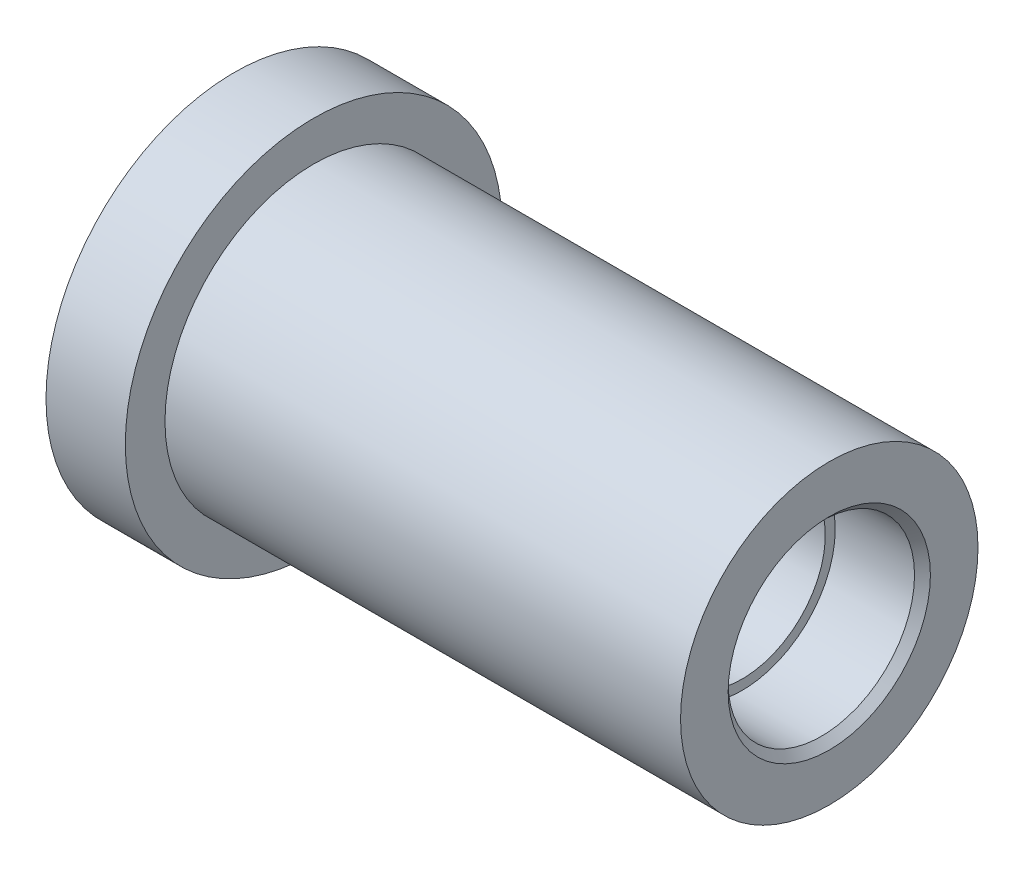
ISO-10303-21;
HEADER;
FILE_DESCRIPTION(('STEP AP214'),'2;1');
FILE_NAME('part.step','',(''),(''),'','','');
FILE_SCHEMA(('AUTOMOTIVE_DESIGN { 1 0 10303 214 1 1 1 1 }'));
ENDSEC;
DATA;
#1=APPLICATION_CONTEXT('core data for automotive mechanical design processes');
#2=APPLICATION_PROTOCOL_DEFINITION('international standard','automotive_design',2000,#1);
#3=PRODUCT_CONTEXT('',#1,'mechanical');
#4=PRODUCT('Part','Part','',(#3));
#5=PRODUCT_RELATED_PRODUCT_CATEGORY('part','',(#4));
#6=PRODUCT_DEFINITION_FORMATION('','',#4);
#7=PRODUCT_DEFINITION_CONTEXT('part definition',#1,'design');
#8=PRODUCT_DEFINITION('design','',#6,#7);
#9=PRODUCT_DEFINITION_SHAPE('','',#8);
#10=(LENGTH_UNIT() NAMED_UNIT(*) SI_UNIT(.MILLI.,.METRE.));
#11=(NAMED_UNIT(*) PLANE_ANGLE_UNIT() SI_UNIT($,.RADIAN.));
#12=(NAMED_UNIT(*) SI_UNIT($,.STERADIAN.) SOLID_ANGLE_UNIT());
#13=UNCERTAINTY_MEASURE_WITH_UNIT(LENGTH_MEASURE(1.E-05),#10,'distance_accuracy_value','');
#14=(GEOMETRIC_REPRESENTATION_CONTEXT(3) GLOBAL_UNCERTAINTY_ASSIGNED_CONTEXT((#13)) GLOBAL_UNIT_ASSIGNED_CONTEXT((#10,
#11,#12)) REPRESENTATION_CONTEXT('',''));
#15=CARTESIAN_POINT('',(0.,0.,0.));
#16=DIRECTION('',(0.,0.,1.));
#17=DIRECTION('',(1.,0.,0.));
#18=AXIS2_PLACEMENT_3D('',#15,#16,#17);
#19=CARTESIAN_POINT('',(0.,0.,0.));
#20=DIRECTION('',(-1.,0.,0.));
#21=DIRECTION('',(0.,0.,1.));
#22=AXIS2_PLACEMENT_3D('',#19,#20,#21);
#23=CYLINDRICAL_SURFACE('',#22,23.5);
#24=CARTESIAN_POINT('',(-69.,0.,0.));
#25=DIRECTION('',(-1.,0.,0.));
#26=DIRECTION('',(0.,0.,1.));
#27=AXIS2_PLACEMENT_3D('',#24,#25,#26);
#28=CIRCLE('',#27,23.5);
#29=CARTESIAN_POINT('',(-69.,0.,23.5));
#30=VERTEX_POINT('',#29);
#31=EDGE_CURVE('E171',#30,#30,#28,.T.);
#32=ORIENTED_EDGE('',*,*,#31,.T.);
#33=EDGE_LOOP('',(#32));
#34=FACE_BOUND('',#33,.T.);
#35=CARTESIAN_POINT('',(-53.,0.,0.));
#36=DIRECTION('',(-1.,0.,0.));
#37=DIRECTION('',(0.,0.,1.));
#38=AXIS2_PLACEMENT_3D('',#35,#36,#37);
#39=CIRCLE('',#38,23.5);
#40=CARTESIAN_POINT('',(-53.,0.,23.5));
#41=VERTEX_POINT('',#40);
#42=EDGE_CURVE('E114',#41,#41,#39,.T.);
#43=ORIENTED_EDGE('',*,*,#42,.F.);
#44=EDGE_LOOP('',(#43));
#45=FACE_BOUND('',#44,.T.);
#46=ADVANCED_FACE('F54',(#34,#45),#23,.F.);
#47=CARTESIAN_POINT('',(0.,0.,0.));
#48=DIRECTION('',(-1.,0.,0.));
#49=DIRECTION('',(0.,0.,1.));
#50=AXIS2_PLACEMENT_3D('',#47,#48,#49);
#51=CYLINDRICAL_SURFACE('',#50,47.5);
#52=CARTESIAN_POINT('',(-75.,0.,0.));
#53=DIRECTION('',(-1.,0.,0.));
#54=DIRECTION('',(0.,0.,1.));
#55=AXIS2_PLACEMENT_3D('',#52,#53,#54);
#56=CIRCLE('',#55,47.5);
#57=CARTESIAN_POINT('',(-75.,0.,47.5));
#58=VERTEX_POINT('',#57);
#59=EDGE_CURVE('E126',#58,#58,#56,.T.);
#60=ORIENTED_EDGE('',*,*,#59,.F.);
#61=EDGE_LOOP('',(#60));
#62=FACE_BOUND('',#61,.T.);
#63=CARTESIAN_POINT('',(-55.,0.,0.));
#64=DIRECTION('',(-1.,0.,0.));
#65=DIRECTION('',(0.,0.,1.));
#66=AXIS2_PLACEMENT_3D('',#63,#64,#65);
#67=CIRCLE('',#66,47.5);
#68=CARTESIAN_POINT('',(-55.,0.,47.5));
#69=VERTEX_POINT('',#68);
#70=EDGE_CURVE('E99',#69,#69,#67,.T.);
#71=ORIENTED_EDGE('',*,*,#70,.T.);
#72=EDGE_LOOP('',(#71));
#73=FACE_BOUND('',#72,.T.);
#74=ADVANCED_FACE('F192',(#62,#73),#51,.T.);
#75=CARTESIAN_POINT('',(75.,47.5,0.));
#76=DIRECTION('',(-1.,0.,0.));
#77=DIRECTION('',(0.,0.,1.));
#78=AXIS2_PLACEMENT_3D('',#75,#76,#77);
#79=PLANE('',#78);
#80=CARTESIAN_POINT('',(75.,0.,0.));
#81=DIRECTION('',(-1.,0.,0.));
#82=DIRECTION('',(0.,0.,1.));
#83=AXIS2_PLACEMENT_3D('',#80,#81,#82);
#84=CIRCLE('',#83,25.5);
#85=CARTESIAN_POINT('',(75.,0.,25.5));
#86=VERTEX_POINT('',#85);
#87=EDGE_CURVE('E165',#86,#86,#84,.T.);
#88=ORIENTED_EDGE('',*,*,#87,.T.);
#89=EDGE_LOOP('',(#88));
#90=FACE_BOUND('',#89,.T.);
#91=CARTESIAN_POINT('',(75.,0.,0.));
#92=DIRECTION('',(-1.,0.,0.));
#93=DIRECTION('',(0.,0.,1.));
#94=AXIS2_PLACEMENT_3D('',#91,#92,#93);
#95=CIRCLE('',#94,37.5);
#96=CARTESIAN_POINT('',(75.,0.,37.5));
#97=VERTEX_POINT('',#96);
#98=EDGE_CURVE('E274',#97,#97,#95,.T.);
#99=ORIENTED_EDGE('',*,*,#98,.F.);
#100=EDGE_LOOP('',(#99));
#101=FACE_BOUND('',#100,.T.);
#102=ADVANCED_FACE('F198',(#90,#101),#79,.F.);
#103=CARTESIAN_POINT('',(-75.,23.5,0.));
#104=DIRECTION('',(1.,0.,0.));
#105=DIRECTION('',(0.,0.,-1.));
#106=AXIS2_PLACEMENT_3D('',#103,#104,#105);
#107=PLANE('',#106);
#108=CARTESIAN_POINT('',(-75.,0.,0.));
#109=DIRECTION('',(1.,0.,0.));
#110=DIRECTION('',(0.,0.,-1.));
#111=AXIS2_PLACEMENT_3D('',#108,#109,#110);
#112=CIRCLE('',#111,28.5);
#113=CARTESIAN_POINT('',(-75.,0.,-28.5));
#114=VERTEX_POINT('',#113);
#115=EDGE_CURVE('E11',#114,#114,#112,.T.);
#116=ORIENTED_EDGE('',*,*,#115,.T.);
#117=EDGE_LOOP('',(#116));
#118=FACE_BOUND('',#117,.T.);
#119=CARTESIAN_POINT('',(-75.,18.7499999999999,-32.4759526419165));
#120=DIRECTION('',(1.,0.,0.));
#121=DIRECTION('',(0.,0.,-1.));
#122=AXIS2_PLACEMENT_3D('',#119,#120,#121);
#123=CIRCLE('',#122,3.49999999999998);
#124=CARTESIAN_POINT('',(-75.,18.7499999999999,-35.9759526419165));
#125=VERTEX_POINT('',#124);
#126=EDGE_CURVE('E147',#125,#125,#123,.T.);
#127=ORIENTED_EDGE('',*,*,#126,.T.);
#128=EDGE_LOOP('',(#127));
#129=FACE_BOUND('',#128,.T.);
#130=CARTESIAN_POINT('',(-75.,-18.7500000000002,-32.4759526419164));
#131=DIRECTION('',(1.,0.,0.));
#132=DIRECTION('',(0.,0.,-1.));
#133=AXIS2_PLACEMENT_3D('',#130,#131,#132);
#134=CIRCLE('',#133,3.49999999999998);
#135=CARTESIAN_POINT('',(-75.,-18.7500000000002,-35.9759526419163));
#136=VERTEX_POINT('',#135);
#137=EDGE_CURVE('E144',#136,#136,#134,.T.);
#138=ORIENTED_EDGE('',*,*,#137,.T.);
#139=EDGE_LOOP('',(#138));
#140=FACE_BOUND('',#139,.T.);
#141=CARTESIAN_POINT('',(-75.,-37.5,0.));
#142=DIRECTION('',(1.,0.,0.));
#143=DIRECTION('',(0.,0.,-1.));
#144=AXIS2_PLACEMENT_3D('',#141,#142,#143);
#145=CIRCLE('',#144,3.49999999999998);
#146=CARTESIAN_POINT('',(-75.,-37.5,-3.49999999999998));
#147=VERTEX_POINT('',#146);
#148=EDGE_CURVE('E141',#147,#147,#145,.T.);
#149=ORIENTED_EDGE('',*,*,#148,.T.);
#150=EDGE_LOOP('',(#149));
#151=FACE_BOUND('',#150,.T.);
#152=CARTESIAN_POINT('',(-75.,-18.7499999999997,32.4759526419166));
#153=DIRECTION('',(1.,0.,0.));
#154=DIRECTION('',(0.,0.,-1.));
#155=AXIS2_PLACEMENT_3D('',#152,#153,#154);
#156=CIRCLE('',#155,3.49999999999998);
#157=CARTESIAN_POINT('',(-75.,-18.7499999999997,28.9759526419166));
#158=VERTEX_POINT('',#157);
#159=EDGE_CURVE('E138',#158,#158,#156,.T.);
#160=ORIENTED_EDGE('',*,*,#159,.T.);
#161=EDGE_LOOP('',(#160));
#162=FACE_BOUND('',#161,.T.);
#163=CARTESIAN_POINT('',(-75.,18.7500000000004,32.4759526419162));
#164=DIRECTION('',(1.,0.,0.));
#165=DIRECTION('',(0.,0.,-1.));
#166=AXIS2_PLACEMENT_3D('',#163,#164,#165);
#167=CIRCLE('',#166,3.49999999999998);
#168=CARTESIAN_POINT('',(-75.,18.7500000000004,28.9759526419163));
#169=VERTEX_POINT('',#168);
#170=EDGE_CURVE('E135',#169,#169,#167,.T.);
#171=ORIENTED_EDGE('',*,*,#170,.T.);
#172=EDGE_LOOP('',(#171));
#173=FACE_BOUND('',#172,.T.);
#174=CARTESIAN_POINT('',(-75.,37.5,0.));
#175=DIRECTION('',(1.,0.,0.));
#176=DIRECTION('',(0.,0.,-1.));
#177=AXIS2_PLACEMENT_3D('',#174,#175,#176);
#178=CIRCLE('',#177,3.49999999999998);
#179=CARTESIAN_POINT('',(-75.,37.5,-3.49999999999998));
#180=VERTEX_POINT('',#179);
#181=EDGE_CURVE('E132',#180,#180,#178,.T.);
#182=ORIENTED_EDGE('',*,*,#181,.T.);
#183=EDGE_LOOP('',(#182));
#184=FACE_BOUND('',#183,.T.);
#185=ORIENTED_EDGE('',*,*,#59,.T.);
#186=EDGE_LOOP('',(#185));
#187=FACE_BOUND('',#186,.T.);
#188=ADVANCED_FACE('F204',(#118,#129,#140,#151,#162,#173,#184,#187),#107,.F.);
#189=CARTESIAN_POINT('',(0.,0.,0.));
#190=DIRECTION('',(-1.,0.,0.));
#191=DIRECTION('',(0.,0.,1.));
#192=AXIS2_PLACEMENT_3D('',#189,#190,#191);
#193=CYLINDRICAL_SURFACE('',#192,23.5);
#194=CARTESIAN_POINT('',(73.,0.,0.));
#195=DIRECTION('',(-1.,0.,0.));
#196=DIRECTION('',(0.,0.,1.));
#197=AXIS2_PLACEMENT_3D('',#194,#195,#196);
#198=CIRCLE('',#197,23.5);
#199=CARTESIAN_POINT('',(73.,0.,23.5));
#200=VERTEX_POINT('',#199);
#201=EDGE_CURVE('E168',#200,#200,#198,.F.);
#202=ORIENTED_EDGE('',*,*,#201,.T.);
#203=EDGE_LOOP('',(#202));
#204=FACE_BOUND('',#203,.T.);
#205=CARTESIAN_POINT('',(53.,0.,0.));
#206=DIRECTION('',(-1.,0.,0.));
#207=DIRECTION('',(0.,0.,1.));
#208=AXIS2_PLACEMENT_3D('',#205,#206,#207);
#209=CIRCLE('',#208,23.5);
#210=CARTESIAN_POINT('',(53.,0.,23.5));
#211=VERTEX_POINT('',#210);
#212=EDGE_CURVE('E123',#211,#211,#209,.T.);
#213=ORIENTED_EDGE('',*,*,#212,.T.);
#214=EDGE_LOOP('',(#213));
#215=FACE_BOUND('',#214,.T.);
#216=ADVANCED_FACE('F344',(#204,#215),#193,.F.);
#217=CARTESIAN_POINT('',(53.,23.5,0.));
#218=DIRECTION('',(-1.,0.,0.));
#219=DIRECTION('',(0.,0.,1.));
#220=AXIS2_PLACEMENT_3D('',#217,#218,#219);
#221=PLANE('',#220);
#222=ORIENTED_EDGE('',*,*,#212,.F.);
#223=EDGE_LOOP('',(#222));
#224=FACE_BOUND('',#223,.T.);
#225=CARTESIAN_POINT('',(53.,0.,0.));
#226=DIRECTION('',(-1.,0.,0.));
#227=DIRECTION('',(0.,0.,1.));
#228=AXIS2_PLACEMENT_3D('',#225,#226,#227);
#229=CIRCLE('',#228,21.);
#230=CARTESIAN_POINT('',(53.,0.,21.));
#231=VERTEX_POINT('',#230);
#232=EDGE_CURVE('E120',#231,#231,#229,.T.);
#233=ORIENTED_EDGE('',*,*,#232,.T.);
#234=EDGE_LOOP('',(#233));
#235=FACE_BOUND('',#234,.T.);
#236=ADVANCED_FACE('F340',(#224,#235),#221,.F.);
#237=CARTESIAN_POINT('',(0.,0.,0.));
#238=DIRECTION('',(-1.,0.,0.));
#239=DIRECTION('',(0.,0.,1.));
#240=AXIS2_PLACEMENT_3D('',#237,#238,#239);
#241=CYLINDRICAL_SURFACE('',#240,21.);
#242=ORIENTED_EDGE('',*,*,#232,.F.);
#243=EDGE_LOOP('',(#242));
#244=FACE_BOUND('',#243,.T.);
#245=CARTESIAN_POINT('',(-53.,0.,0.));
#246=DIRECTION('',(-1.,0.,0.));
#247=DIRECTION('',(0.,0.,1.));
#248=AXIS2_PLACEMENT_3D('',#245,#246,#247);
#249=CIRCLE('',#248,21.);
#250=CARTESIAN_POINT('',(-53.,0.,21.));
#251=VERTEX_POINT('',#250);
#252=EDGE_CURVE('E117',#251,#251,#249,.T.);
#253=ORIENTED_EDGE('',*,*,#252,.T.);
#254=EDGE_LOOP('',(#253));
#255=FACE_BOUND('',#254,.T.);
#256=ADVANCED_FACE('F336',(#244,#255),#241,.F.);
#257=CARTESIAN_POINT('',(-53.,23.5,0.));
#258=DIRECTION('',(1.,0.,0.));
#259=DIRECTION('',(0.,0.,-1.));
#260=AXIS2_PLACEMENT_3D('',#257,#258,#259);
#261=PLANE('',#260);
#262=ORIENTED_EDGE('',*,*,#252,.F.);
#263=EDGE_LOOP('',(#262));
#264=FACE_BOUND('',#263,.T.);
#265=ORIENTED_EDGE('',*,*,#42,.T.);
#266=EDGE_LOOP('',(#265));
#267=FACE_BOUND('',#266,.T.);
#268=ADVANCED_FACE('F333',(#264,#267),#261,.F.);
#269=CARTESIAN_POINT('',(-59.5021515475689,37.5,0.));
#270=DIRECTION('',(-1.,0.,0.));
#271=DIRECTION('',(0.,0.,1.));
#272=AXIS2_PLACEMENT_3D('',#269,#270,#271);
#273=CONICAL_SURFACE('',#272,2.5,1.02974425867665);
#274=CARTESIAN_POINT('',(-58.,37.5,0.));
#275=VERTEX_POINT('',#274);
#276=VERTEX_LOOP('',#275);
#277=FACE_BOUND('',#276,.T.);
#278=CARTESIAN_POINT('',(-59.5021515475689,37.5,0.));
#279=DIRECTION('',(-1.,0.,0.));
#280=DIRECTION('',(0.,0.,1.));
#281=AXIS2_PLACEMENT_3D('',#278,#279,#280);
#282=CIRCLE('',#281,2.5);
#283=CARTESIAN_POINT('',(-59.5021515475689,37.5,2.5));
#284=VERTEX_POINT('',#283);
#285=EDGE_CURVE('E111',#284,#284,#282,.T.);
#286=ORIENTED_EDGE('',*,*,#285,.T.);
#287=EDGE_LOOP('',(#286));
#288=FACE_BOUND('',#287,.T.);
#289=ADVANCED_FACE('F329',(#277,#288),#273,.F.);
#290=CARTESIAN_POINT('',(-75.,37.5,0.));
#291=DIRECTION('',(-1.,0.,0.));
#292=DIRECTION('',(0.,0.,1.));
#293=AXIS2_PLACEMENT_3D('',#290,#291,#292);
#294=CYLINDRICAL_SURFACE('',#293,2.5);
#295=CARTESIAN_POINT('',(-74.,37.5,0.));
#296=DIRECTION('',(1.,0.,0.));
#297=DIRECTION('',(0.,0.,-1.));
#298=AXIS2_PLACEMENT_3D('',#295,#296,#297);
#299=CIRCLE('',#298,2.5);
#300=CARTESIAN_POINT('',(-74.,37.5,-2.5));
#301=VERTEX_POINT('',#300);
#302=EDGE_CURVE('E162',#301,#301,#299,.F.);
#303=ORIENTED_EDGE('',*,*,#302,.T.);
#304=EDGE_LOOP('',(#303));
#305=FACE_BOUND('',#304,.T.);
#306=ORIENTED_EDGE('',*,*,#285,.F.);
#307=EDGE_LOOP('',(#306));
#308=FACE_BOUND('',#307,.T.);
#309=ADVANCED_FACE('F326',(#305,#308),#294,.F.);
#310=CARTESIAN_POINT('',(-59.5021515475689,18.7499999999999,-32.4759526419165));
#311=DIRECTION('',(-1.,0.,0.));
#312=DIRECTION('',(0.,0.,1.));
#313=AXIS2_PLACEMENT_3D('',#310,#311,#312);
#314=CONICAL_SURFACE('',#313,2.5,1.02974425867665);
#315=CARTESIAN_POINT('',(-58.,18.7499999999999,-32.4759526419165));
#316=VERTEX_POINT('',#315);
#317=VERTEX_LOOP('',#316);
#318=FACE_BOUND('',#317,.T.);
#319=CARTESIAN_POINT('',(-59.5021515475689,18.7499999999999,-32.4759526419165));
#320=DIRECTION('',(-1.,0.,0.));
#321=DIRECTION('',(0.,0.,1.));
#322=AXIS2_PLACEMENT_3D('',#319,#320,#321);
#323=CIRCLE('',#322,2.5);
#324=CARTESIAN_POINT('',(-59.5021515475689,18.7499999999999,-29.9759526419165));
#325=VERTEX_POINT('',#324);
#326=EDGE_CURVE('E108',#325,#325,#323,.T.);
#327=ORIENTED_EDGE('',*,*,#326,.T.);
#328=EDGE_LOOP('',(#327));
#329=FACE_BOUND('',#328,.T.);
#330=ADVANCED_FACE('F322',(#318,#329),#314,.F.);
#331=CARTESIAN_POINT('',(-75.,18.7499999999999,-32.4759526419165));
#332=DIRECTION('',(-1.,0.,0.));
#333=DIRECTION('',(0.,0.,1.));
#334=AXIS2_PLACEMENT_3D('',#331,#332,#333);
#335=CYLINDRICAL_SURFACE('',#334,2.5);
#336=CARTESIAN_POINT('',(-74.,18.7499999999999,-32.4759526419165));
#337=DIRECTION('',(1.,0.,0.));
#338=DIRECTION('',(0.,0.,-1.));
#339=AXIS2_PLACEMENT_3D('',#336,#337,#338);
#340=CIRCLE('',#339,2.5);
#341=CARTESIAN_POINT('',(-74.,18.7499999999999,-34.9759526419165));
#342=VERTEX_POINT('',#341);
#343=EDGE_CURVE('E129',#342,#342,#340,.F.);
#344=ORIENTED_EDGE('',*,*,#343,.T.);
#345=EDGE_LOOP('',(#344));
#346=FACE_BOUND('',#345,.T.);
#347=ORIENTED_EDGE('',*,*,#326,.F.);
#348=EDGE_LOOP('',(#347));
#349=FACE_BOUND('',#348,.T.);
#350=ADVANCED_FACE('F318',(#346,#349),#335,.F.);
#351=CARTESIAN_POINT('',(-59.5021515475689,-18.7500000000002,-32.4759526419164));
#352=DIRECTION('',(-1.,0.,0.));
#353=DIRECTION('',(0.,0.,1.));
#354=AXIS2_PLACEMENT_3D('',#351,#352,#353);
#355=CONICAL_SURFACE('',#354,2.5,1.02974425867665);
#356=CARTESIAN_POINT('',(-58.,-18.7500000000002,-32.4759526419164));
#357=VERTEX_POINT('',#356);
#358=VERTEX_LOOP('',#357);
#359=FACE_BOUND('',#358,.T.);
#360=CARTESIAN_POINT('',(-59.5021515475689,-18.7500000000002,-32.4759526419164));
#361=DIRECTION('',(-1.,0.,0.));
#362=DIRECTION('',(0.,0.,1.));
#363=AXIS2_PLACEMENT_3D('',#360,#361,#362);
#364=CIRCLE('',#363,2.5);
#365=CARTESIAN_POINT('',(-59.5021515475689,-18.7500000000002,-29.9759526419164));
#366=VERTEX_POINT('',#365);
#367=EDGE_CURVE('E105',#366,#366,#364,.T.);
#368=ORIENTED_EDGE('',*,*,#367,.T.);
#369=EDGE_LOOP('',(#368));
#370=FACE_BOUND('',#369,.T.);
#371=ADVANCED_FACE('F314',(#359,#370),#355,.F.);
#372=CARTESIAN_POINT('',(-75.,-18.7500000000002,-32.4759526419164));
#373=DIRECTION('',(-1.,0.,0.));
#374=DIRECTION('',(0.,0.,1.));
#375=AXIS2_PLACEMENT_3D('',#372,#373,#374);
#376=CYLINDRICAL_SURFACE('',#375,2.5);
#377=CARTESIAN_POINT('',(-74.,-18.7500000000002,-32.4759526419164));
#378=DIRECTION('',(1.,0.,0.));
#379=DIRECTION('',(0.,0.,-1.));
#380=AXIS2_PLACEMENT_3D('',#377,#378,#379);
#381=CIRCLE('',#380,2.5);
#382=CARTESIAN_POINT('',(-74.,-18.7500000000002,-34.9759526419164));
#383=VERTEX_POINT('',#382);
#384=EDGE_CURVE('E150',#383,#383,#381,.F.);
#385=ORIENTED_EDGE('',*,*,#384,.T.);
#386=EDGE_LOOP('',(#385));
#387=FACE_BOUND('',#386,.T.);
#388=ORIENTED_EDGE('',*,*,#367,.F.);
#389=EDGE_LOOP('',(#388));
#390=FACE_BOUND('',#389,.T.);
#391=ADVANCED_FACE('F310',(#387,#390),#376,.F.);
#392=CARTESIAN_POINT('',(-59.5021515475689,-37.5,0.));
#393=DIRECTION('',(-1.,0.,0.));
#394=DIRECTION('',(0.,0.,1.));
#395=AXIS2_PLACEMENT_3D('',#392,#393,#394);
#396=CONICAL_SURFACE('',#395,2.5,1.02974425867665);
#397=CARTESIAN_POINT('',(-58.,-37.5,0.));
#398=VERTEX_POINT('',#397);
#399=VERTEX_LOOP('',#398);
#400=FACE_BOUND('',#399,.T.);
#401=CARTESIAN_POINT('',(-59.5021515475689,-37.5,0.));
#402=DIRECTION('',(-1.,0.,0.));
#403=DIRECTION('',(0.,0.,1.));
#404=AXIS2_PLACEMENT_3D('',#401,#402,#403);
#405=CIRCLE('',#404,2.5);
#406=CARTESIAN_POINT('',(-59.5021515475689,-37.5,2.5));
#407=VERTEX_POINT('',#406);
#408=EDGE_CURVE('E96',#407,#407,#405,.T.);
#409=ORIENTED_EDGE('',*,*,#408,.T.);
#410=EDGE_LOOP('',(#409));
#411=FACE_BOUND('',#410,.T.);
#412=ADVANCED_FACE('F306',(#400,#411),#396,.F.);
#413=CARTESIAN_POINT('',(-75.,-37.5,0.));
#414=DIRECTION('',(-1.,0.,0.));
#415=DIRECTION('',(0.,0.,1.));
#416=AXIS2_PLACEMENT_3D('',#413,#414,#415);
#417=CYLINDRICAL_SURFACE('',#416,2.5);
#418=CARTESIAN_POINT('',(-74.,-37.5,0.));
#419=DIRECTION('',(1.,0.,0.));
#420=DIRECTION('',(0.,0.,-1.));
#421=AXIS2_PLACEMENT_3D('',#418,#419,#420);
#422=CIRCLE('',#421,2.5);
#423=CARTESIAN_POINT('',(-74.,-37.5,-2.5));
#424=VERTEX_POINT('',#423);
#425=EDGE_CURVE('E153',#424,#424,#422,.F.);
#426=ORIENTED_EDGE('',*,*,#425,.T.);
#427=EDGE_LOOP('',(#426));
#428=FACE_BOUND('',#427,.T.);
#429=ORIENTED_EDGE('',*,*,#408,.F.);
#430=EDGE_LOOP('',(#429));
#431=FACE_BOUND('',#430,.T.);
#432=ADVANCED_FACE('F302',(#428,#431),#417,.F.);
#433=CARTESIAN_POINT('',(-59.5021515475689,-18.7499999999997,32.4759526419166));
#434=DIRECTION('',(-1.,0.,0.));
#435=DIRECTION('',(0.,0.,1.));
#436=AXIS2_PLACEMENT_3D('',#433,#434,#435);
#437=CONICAL_SURFACE('',#436,2.5,1.02974425867665);
#438=CARTESIAN_POINT('',(-58.,-18.7499999999997,32.4759526419166));
#439=VERTEX_POINT('',#438);
#440=VERTEX_LOOP('',#439);
#441=FACE_BOUND('',#440,.T.);
#442=CARTESIAN_POINT('',(-59.5021515475689,-18.7499999999997,32.4759526419166));
#443=DIRECTION('',(-1.,0.,0.));
#444=DIRECTION('',(0.,0.,1.));
#445=AXIS2_PLACEMENT_3D('',#442,#443,#444);
#446=CIRCLE('',#445,2.5);
#447=CARTESIAN_POINT('',(-59.5021515475689,-18.7499999999997,34.9759526419166));
#448=VERTEX_POINT('',#447);
#449=EDGE_CURVE('E92',#448,#448,#446,.T.);
#450=ORIENTED_EDGE('',*,*,#449,.T.);
#451=EDGE_LOOP('',(#450));
#452=FACE_BOUND('',#451,.T.);
#453=ADVANCED_FACE('F298',(#441,#452),#437,.F.);
#454=CARTESIAN_POINT('',(-75.,-18.7499999999997,32.4759526419166));
#455=DIRECTION('',(-1.,0.,0.));
#456=DIRECTION('',(0.,0.,1.));
#457=AXIS2_PLACEMENT_3D('',#454,#455,#456);
#458=CYLINDRICAL_SURFACE('',#457,2.5);
#459=CARTESIAN_POINT('',(-74.,-18.7499999999997,32.4759526419166));
#460=DIRECTION('',(1.,0.,0.));
#461=DIRECTION('',(0.,0.,-1.));
#462=AXIS2_PLACEMENT_3D('',#459,#460,#461);
#463=CIRCLE('',#462,2.5);
#464=CARTESIAN_POINT('',(-74.,-18.7499999999997,29.9759526419166));
#465=VERTEX_POINT('',#464);
#466=EDGE_CURVE('E156',#465,#465,#463,.F.);
#467=ORIENTED_EDGE('',*,*,#466,.T.);
#468=EDGE_LOOP('',(#467));
#469=FACE_BOUND('',#468,.T.);
#470=ORIENTED_EDGE('',*,*,#449,.F.);
#471=EDGE_LOOP('',(#470));
#472=FACE_BOUND('',#471,.T.);
#473=ADVANCED_FACE('F86',(#469,#472),#458,.F.);
#474=CARTESIAN_POINT('',(-59.5021515475689,18.7500000000004,32.4759526419162));
#475=DIRECTION('',(-1.,0.,0.));
#476=DIRECTION('',(0.,0.,1.));
#477=AXIS2_PLACEMENT_3D('',#474,#475,#476);
#478=CONICAL_SURFACE('',#477,2.5,1.02974425867665);
#479=CARTESIAN_POINT('',(-58.,18.7500000000004,32.4759526419162));
#480=VERTEX_POINT('',#479);
#481=VERTEX_LOOP('',#480);
#482=FACE_BOUND('',#481,.T.);
#483=CARTESIAN_POINT('',(-59.5021515475689,18.7500000000004,32.4759526419162));
#484=DIRECTION('',(-1.,0.,0.));
#485=DIRECTION('',(0.,0.,1.));
#486=AXIS2_PLACEMENT_3D('',#483,#484,#485);
#487=CIRCLE('',#486,2.5);
#488=CARTESIAN_POINT('',(-59.5021515475689,18.7500000000004,34.9759526419162));
#489=VERTEX_POINT('',#488);
#490=EDGE_CURVE('E90',#489,#489,#487,.T.);
#491=ORIENTED_EDGE('',*,*,#490,.T.);
#492=EDGE_LOOP('',(#491));
#493=FACE_BOUND('',#492,.T.);
#494=ADVANCED_FACE('F82',(#482,#493),#478,.F.);
#495=CARTESIAN_POINT('',(-75.,18.7500000000004,32.4759526419162));
#496=DIRECTION('',(-1.,0.,0.));
#497=DIRECTION('',(0.,0.,1.));
#498=AXIS2_PLACEMENT_3D('',#495,#496,#497);
#499=CYLINDRICAL_SURFACE('',#498,2.5);
#500=CARTESIAN_POINT('',(-74.,18.7500000000004,32.4759526419162));
#501=DIRECTION('',(1.,0.,0.));
#502=DIRECTION('',(0.,0.,-1.));
#503=AXIS2_PLACEMENT_3D('',#500,#501,#502);
#504=CIRCLE('',#503,2.5);
#505=CARTESIAN_POINT('',(-74.,18.7500000000004,29.9759526419162));
#506=VERTEX_POINT('',#505);
#507=EDGE_CURVE('E159',#506,#506,#504,.F.);
#508=ORIENTED_EDGE('',*,*,#507,.T.);
#509=EDGE_LOOP('',(#508));
#510=FACE_BOUND('',#509,.T.);
#511=ORIENTED_EDGE('',*,*,#490,.F.);
#512=EDGE_LOOP('',(#511));
#513=FACE_BOUND('',#512,.T.);
#514=ADVANCED_FACE('F85',(#510,#513),#499,.F.);
#515=CARTESIAN_POINT('',(-74.,18.7499999999999,-32.4759526419165));
#516=DIRECTION('',(-1.,0.,0.));
#517=DIRECTION('',(0.,0.,1.));
#518=AXIS2_PLACEMENT_3D('',#515,#516,#517);
#519=CONICAL_SURFACE('',#518,2.5,0.785398163397451);
#520=ORIENTED_EDGE('',*,*,#126,.F.);
#521=EDGE_LOOP('',(#520));
#522=FACE_BOUND('',#521,.T.);
#523=ORIENTED_EDGE('',*,*,#343,.F.);
#524=EDGE_LOOP('',(#523));
#525=FACE_BOUND('',#524,.T.);
#526=ADVANCED_FACE('F206',(#522,#525),#519,.F.);
#527=CARTESIAN_POINT('',(-74.,-18.7500000000002,-32.4759526419164));
#528=DIRECTION('',(-1.,0.,0.));
#529=DIRECTION('',(0.,0.,1.));
#530=AXIS2_PLACEMENT_3D('',#527,#528,#529);
#531=CONICAL_SURFACE('',#530,2.5,0.785398163397451);
#532=ORIENTED_EDGE('',*,*,#137,.F.);
#533=EDGE_LOOP('',(#532));
#534=FACE_BOUND('',#533,.T.);
#535=ORIENTED_EDGE('',*,*,#384,.F.);
#536=EDGE_LOOP('',(#535));
#537=FACE_BOUND('',#536,.T.);
#538=ADVANCED_FACE('F212',(#534,#537),#531,.F.);
#539=CARTESIAN_POINT('',(-74.,-37.5,0.));
#540=DIRECTION('',(-1.,0.,0.));
#541=DIRECTION('',(0.,0.,1.));
#542=AXIS2_PLACEMENT_3D('',#539,#540,#541);
#543=CONICAL_SURFACE('',#542,2.5,0.785398163397452);
#544=ORIENTED_EDGE('',*,*,#148,.F.);
#545=EDGE_LOOP('',(#544));
#546=FACE_BOUND('',#545,.T.);
#547=ORIENTED_EDGE('',*,*,#425,.F.);
#548=EDGE_LOOP('',(#547));
#549=FACE_BOUND('',#548,.T.);
#550=ADVANCED_FACE('F219',(#546,#549),#543,.F.);
#551=CARTESIAN_POINT('',(-74.,-18.7499999999997,32.4759526419166));
#552=DIRECTION('',(-1.,0.,0.));
#553=DIRECTION('',(0.,0.,1.));
#554=AXIS2_PLACEMENT_3D('',#551,#552,#553);
#555=CONICAL_SURFACE('',#554,2.5,0.785398163397451);
#556=ORIENTED_EDGE('',*,*,#159,.F.);
#557=EDGE_LOOP('',(#556));
#558=FACE_BOUND('',#557,.T.);
#559=ORIENTED_EDGE('',*,*,#466,.F.);
#560=EDGE_LOOP('',(#559));
#561=FACE_BOUND('',#560,.T.);
#562=ADVANCED_FACE('F226',(#558,#561),#555,.F.);
#563=CARTESIAN_POINT('',(-74.,18.7500000000004,32.4759526419162));
#564=DIRECTION('',(-1.,0.,0.));
#565=DIRECTION('',(0.,0.,1.));
#566=AXIS2_PLACEMENT_3D('',#563,#564,#565);
#567=CONICAL_SURFACE('',#566,2.5,0.785398163397451);
#568=ORIENTED_EDGE('',*,*,#170,.F.);
#569=EDGE_LOOP('',(#568));
#570=FACE_BOUND('',#569,.T.);
#571=ORIENTED_EDGE('',*,*,#507,.F.);
#572=EDGE_LOOP('',(#571));
#573=FACE_BOUND('',#572,.T.);
#574=ADVANCED_FACE('F233',(#570,#573),#567,.F.);
#575=CARTESIAN_POINT('',(-74.,37.5,0.));
#576=DIRECTION('',(-1.,0.,0.));
#577=DIRECTION('',(0.,0.,1.));
#578=AXIS2_PLACEMENT_3D('',#575,#576,#577);
#579=CONICAL_SURFACE('',#578,2.5,0.785398163397452);
#580=ORIENTED_EDGE('',*,*,#181,.F.);
#581=EDGE_LOOP('',(#580));
#582=FACE_BOUND('',#581,.T.);
#583=ORIENTED_EDGE('',*,*,#302,.F.);
#584=EDGE_LOOP('',(#583));
#585=FACE_BOUND('',#584,.T.);
#586=ADVANCED_FACE('F240',(#582,#585),#579,.F.);
#587=CARTESIAN_POINT('',(75.,0.,0.));
#588=DIRECTION('',(1.,0.,0.));
#589=DIRECTION('',(0.,0.,-1.));
#590=AXIS2_PLACEMENT_3D('',#587,#588,#589);
#591=CONICAL_SURFACE('',#590,25.5,0.785398163397443);
#592=ORIENTED_EDGE('',*,*,#201,.F.);
#593=EDGE_LOOP('',(#592));
#594=FACE_BOUND('',#593,.T.);
#595=ORIENTED_EDGE('',*,*,#87,.F.);
#596=EDGE_LOOP('',(#595));
#597=FACE_BOUND('',#596,.T.);
#598=ADVANCED_FACE('F247',(#594,#597),#591,.F.);
#599=CARTESIAN_POINT('',(-75.,0.,0.));
#600=DIRECTION('',(-1.,0.,0.));
#601=DIRECTION('',(0.,0.,1.));
#602=AXIS2_PLACEMENT_3D('',#599,#600,#601);
#603=CYLINDRICAL_SURFACE('',#602,37.5);
#604=ORIENTED_EDGE('',*,*,#98,.T.);
#605=EDGE_LOOP('',(#604));
#606=FACE_BOUND('',#605,.T.);
#607=CARTESIAN_POINT('',(-55.,0.,0.));
#608=DIRECTION('',(-1.,0.,0.));
#609=DIRECTION('',(0.,0.,1.));
#610=AXIS2_PLACEMENT_3D('',#607,#608,#609);
#611=CIRCLE('',#610,37.5);
#612=CARTESIAN_POINT('',(-55.,0.,37.5));
#613=VERTEX_POINT('',#612);
#614=EDGE_CURVE('E93',#613,#613,#611,.T.);
#615=ORIENTED_EDGE('',*,*,#614,.F.);
#616=EDGE_LOOP('',(#615));
#617=FACE_BOUND('',#616,.T.);
#618=ADVANCED_FACE('F253',(#606,#617),#603,.T.);
#619=CARTESIAN_POINT('',(-55.,47.5,0.));
#620=DIRECTION('',(1.,0.,0.));
#621=DIRECTION('',(0.,0.,-1.));
#622=AXIS2_PLACEMENT_3D('',#619,#620,#621);
#623=PLANE('',#622);
#624=ORIENTED_EDGE('',*,*,#614,.T.);
#625=EDGE_LOOP('',(#624));
#626=FACE_BOUND('',#625,.T.);
#627=ORIENTED_EDGE('',*,*,#70,.F.);
#628=EDGE_LOOP('',(#627));
#629=FACE_BOUND('',#628,.T.);
#630=ADVANCED_FACE('F262',(#626,#629),#623,.T.);
#631=CARTESIAN_POINT('',(-70.,0.,0.));
#632=DIRECTION('',(-1.,0.,0.));
#633=DIRECTION('',(0.,0.,1.));
#634=AXIS2_PLACEMENT_3D('',#631,#632,#633);
#635=CYLINDRICAL_SURFACE('',#634,27.5);
#636=CARTESIAN_POINT('',(-74.0000000000001,0.,0.));
#637=DIRECTION('',(1.,0.,0.));
#638=DIRECTION('',(0.,0.,-1.));
#639=AXIS2_PLACEMENT_3D('',#636,#637,#638);
#640=CIRCLE('',#639,27.5);
#641=CARTESIAN_POINT('',(-74.0000000000001,0.,-27.5));
#642=VERTEX_POINT('',#641);
#643=EDGE_CURVE('E63',#642,#642,#640,.F.);
#644=ORIENTED_EDGE('',*,*,#643,.T.);
#645=EDGE_LOOP('',(#644));
#646=FACE_BOUND('',#645,.T.);
#647=CARTESIAN_POINT('',(-70.,0.,0.));
#648=DIRECTION('',(-1.,0.,0.));
#649=DIRECTION('',(0.,0.,1.));
#650=AXIS2_PLACEMENT_3D('',#647,#648,#649);
#651=CIRCLE('',#650,27.5);
#652=CARTESIAN_POINT('',(-70.,0.,27.5));
#653=VERTEX_POINT('',#652);
#654=EDGE_CURVE('E275',#653,#653,#651,.T.);
#655=ORIENTED_EDGE('',*,*,#654,.F.);
#656=EDGE_LOOP('',(#655));
#657=FACE_BOUND('',#656,.T.);
#658=ADVANCED_FACE('F179',(#646,#657),#635,.F.);
#659=CARTESIAN_POINT('',(-70.,0.,0.));
#660=DIRECTION('',(-1.,0.,0.));
#661=DIRECTION('',(0.,0.,1.));
#662=AXIS2_PLACEMENT_3D('',#659,#660,#661);
#663=PLANE('',#662);
#664=CARTESIAN_POINT('',(-70.,0.,0.));
#665=DIRECTION('',(-1.,0.,0.));
#666=DIRECTION('',(0.,0.,1.));
#667=AXIS2_PLACEMENT_3D('',#664,#665,#666);
#668=CIRCLE('',#667,24.5);
#669=CARTESIAN_POINT('',(-70.,0.,24.5));
#670=VERTEX_POINT('',#669);
#671=EDGE_CURVE('E174',#670,#670,#668,.F.);
#672=ORIENTED_EDGE('',*,*,#671,.T.);
#673=EDGE_LOOP('',(#672));
#674=FACE_BOUND('',#673,.T.);
#675=ORIENTED_EDGE('',*,*,#654,.T.);
#676=EDGE_LOOP('',(#675));
#677=FACE_BOUND('',#676,.T.);
#678=ADVANCED_FACE('F188',(#674,#677),#663,.T.);
#679=CARTESIAN_POINT('',(-69.,0.,0.));
#680=DIRECTION('',(-1.,0.,0.));
#681=DIRECTION('',(0.,0.,1.));
#682=AXIS2_PLACEMENT_3D('',#679,#680,#681);
#683=CONICAL_SURFACE('',#682,23.5,0.785398163397448);
#684=ORIENTED_EDGE('',*,*,#671,.F.);
#685=EDGE_LOOP('',(#684));
#686=FACE_BOUND('',#685,.T.);
#687=ORIENTED_EDGE('',*,*,#31,.F.);
#688=EDGE_LOOP('',(#687));
#689=FACE_BOUND('',#688,.T.);
#690=ADVANCED_FACE('F183',(#686,#689),#683,.F.);
#691=CARTESIAN_POINT('',(-74.0000000000001,0.,0.));
#692=DIRECTION('',(-1.,0.,0.));
#693=DIRECTION('',(0.,0.,1.));
#694=AXIS2_PLACEMENT_3D('',#691,#692,#693);
#695=CONICAL_SURFACE('',#694,27.5,0.785398163397453);
#696=ORIENTED_EDGE('',*,*,#115,.F.);
#697=EDGE_LOOP('',(#696));
#698=FACE_BOUND('',#697,.T.);
#699=ORIENTED_EDGE('',*,*,#643,.F.);
#700=EDGE_LOOP('',(#699));
#701=FACE_BOUND('',#700,.T.);
#702=ADVANCED_FACE('F57',(#698,#701),#695,.F.);
#703=CLOSED_SHELL('',(#46,#74,#102,#188,#216,#236,#256,#268,#289,#309,#330,#350,#371,#391,#412,
#432,#453,#473,#494,#514,#526,#538,#550,#562,#574,#586,#598,#618,#630,#658,#678,#690,#702));
#704=MANIFOLD_SOLID_BREP('B2',#703);
#705=ADVANCED_BREP_SHAPE_REPRESENTATION('',(#18,#704),#14);
#706=SHAPE_DEFINITION_REPRESENTATION(#9,#705);
ENDSEC;
END-ISO-10303-21;
